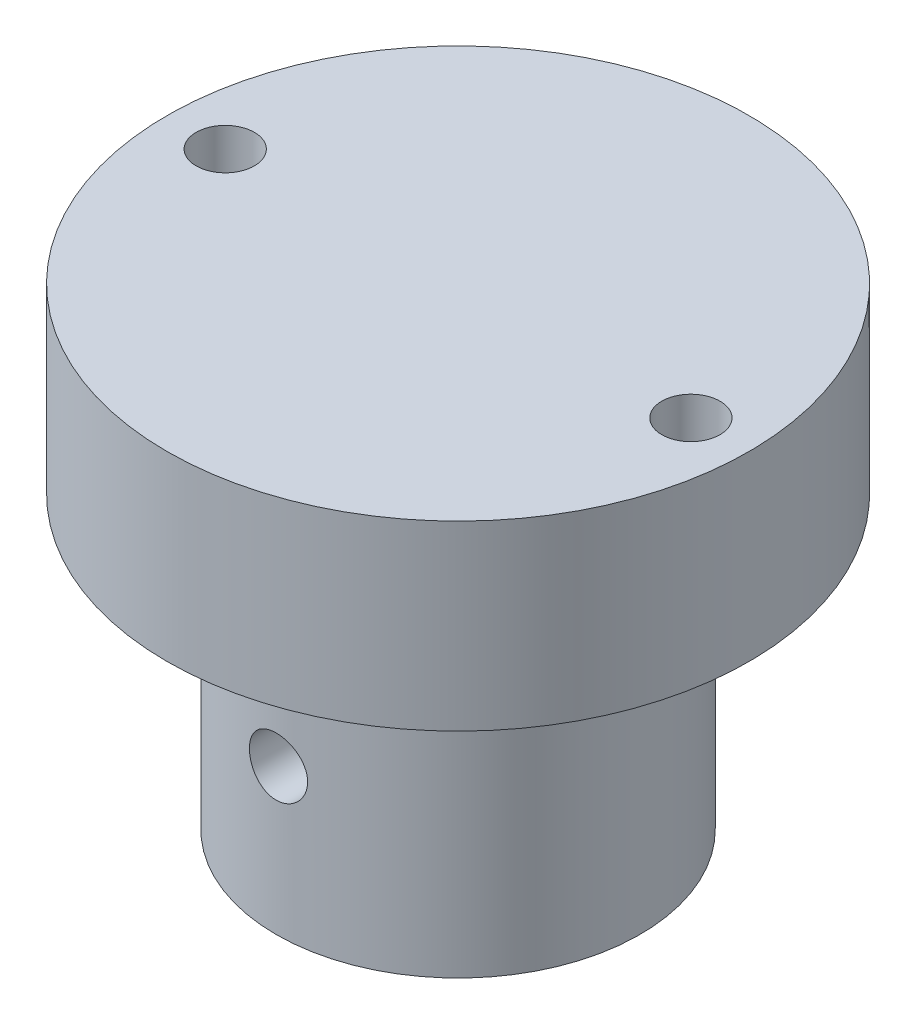
ISO-10303-21;
HEADER;
FILE_DESCRIPTION(('STEP AP214'),'2;1');
FILE_NAME('part.step','',(''),(''),'','','');
FILE_SCHEMA(('AUTOMOTIVE_DESIGN { 1 0 10303 214 1 1 1 1 }'));
ENDSEC;
DATA;
#1=APPLICATION_CONTEXT('core data for automotive mechanical design processes');
#2=APPLICATION_PROTOCOL_DEFINITION('international standard','automotive_design',2000,#1);
#3=PRODUCT_CONTEXT('',#1,'mechanical');
#4=PRODUCT('Part','Part','',(#3));
#5=PRODUCT_RELATED_PRODUCT_CATEGORY('part','',(#4));
#6=PRODUCT_DEFINITION_FORMATION('','',#4);
#7=PRODUCT_DEFINITION_CONTEXT('part definition',#1,'design');
#8=PRODUCT_DEFINITION('design','',#6,#7);
#9=PRODUCT_DEFINITION_SHAPE('','',#8);
#10=(LENGTH_UNIT() NAMED_UNIT(*) SI_UNIT(.MILLI.,.METRE.));
#11=(NAMED_UNIT(*) PLANE_ANGLE_UNIT() SI_UNIT($,.RADIAN.));
#12=(NAMED_UNIT(*) SI_UNIT($,.STERADIAN.) SOLID_ANGLE_UNIT());
#13=UNCERTAINTY_MEASURE_WITH_UNIT(LENGTH_MEASURE(1.E-05),#10,'distance_accuracy_value','');
#14=(GEOMETRIC_REPRESENTATION_CONTEXT(3) GLOBAL_UNCERTAINTY_ASSIGNED_CONTEXT((#13)) GLOBAL_UNIT_ASSIGNED_CONTEXT((#10,
#11,#12)) REPRESENTATION_CONTEXT('',''));
#15=CARTESIAN_POINT('',(0.,0.,0.));
#16=DIRECTION('',(0.,0.,1.));
#17=DIRECTION('',(1.,0.,0.));
#18=AXIS2_PLACEMENT_3D('',#15,#16,#17);
#19=CARTESIAN_POINT('',(0.,10.16,0.));
#20=DIRECTION('',(0.,-1.,0.));
#21=DIRECTION('',(0.,0.,-1.));
#22=AXIS2_PLACEMENT_3D('',#19,#20,#21);
#23=CYLINDRICAL_SURFACE('',#22,6.35);
#24=CARTESIAN_POINT('',(0.,0.,0.));
#25=DIRECTION('',(0.,1.,0.));
#26=DIRECTION('',(0.,0.,1.));
#27=AXIS2_PLACEMENT_3D('',#24,#25,#26);
#28=CIRCLE('',#27,6.35);
#29=CARTESIAN_POINT('',(0.,0.,6.35));
#30=VERTEX_POINT('',#29);
#31=EDGE_CURVE('E40',#30,#30,#28,.T.);
#32=ORIENTED_EDGE('',*,*,#31,.T.);
#33=EDGE_LOOP('',(#32));
#34=FACE_BOUND('',#33,.T.);
#35=CARTESIAN_POINT('',(-1.016,5.08,6.26819304106056));
#36=CARTESIAN_POINT('',(-1.01599769504324,5.13667589140187,6.26819403551404));
#37=CARTESIAN_POINT('',(-1.01124159204673,5.19338353794778,6.26897004691585));
#38=CARTESIAN_POINT('',(-0.992349783147829,5.30521003843499,6.27198771662539));
#39=CARTESIAN_POINT('',(-0.978205221741949,5.36032734104515,6.2742307586555));
#40=CARTESIAN_POINT('',(-0.94097334251936,5.46733847506112,6.27992208580791));
#41=CARTESIAN_POINT('',(-0.917893246383186,5.51923487039731,6.28336939742283));
#42=CARTESIAN_POINT('',(-0.86346305157436,5.61841217203581,6.29107968557929));
#43=CARTESIAN_POINT('',(-0.832113968966905,5.66569364442702,6.29534256188933));
#44=CARTESIAN_POINT('',(-0.761731472401225,5.75473521786042,6.30424698435201));
#45=CARTESIAN_POINT('',(-0.722637613434505,5.7964472668791,6.30889132920186));
#46=CARTESIAN_POINT('',(-0.6380058858614,5.87274896550724,6.31801047882019));
#47=CARTESIAN_POINT('',(-0.592467647153622,5.90733820577275,6.32248527383266));
#48=CARTESIAN_POINT('',(-0.495929877850886,5.96859154833621,6.33079062048891));
#49=CARTESIAN_POINT('',(-0.444901748992711,5.99521111869177,6.33461750200122));
#50=CARTESIAN_POINT('',(-0.339027005912608,6.03948344504246,6.34116475032308));
#51=CARTESIAN_POINT('',(-0.284180620955612,6.05713673888526,6.34388518350168));
#52=CARTESIAN_POINT('',(-0.172722097504602,6.08282895413612,6.34789326388865));
#53=CARTESIAN_POINT('',(-0.116128984586578,6.09094850865779,6.34919292097404));
#54=CARTESIAN_POINT('',(-0.00236972222130401,6.09759334610754,6.35025423457713));
#55=CARTESIAN_POINT('',(0.0547963909724093,6.09611923224563,6.35001598779185));
#56=CARTESIAN_POINT('',(0.167528095717094,6.08368176927201,6.34803788122686));
#57=CARTESIAN_POINT('',(0.223103535159279,6.07280518520236,6.34631175189527));
#58=CARTESIAN_POINT('',(0.331630194115818,6.04200797457068,6.34156712875674));
#59=CARTESIAN_POINT('',(0.384581338647916,6.02208708975682,6.33854859804658));
#60=CARTESIAN_POINT('',(0.486616241095792,5.97367946298034,6.33153486057529));
#61=CARTESIAN_POINT('',(0.535682593094869,5.94515665048293,6.32753555457914));
#62=CARTESIAN_POINT('',(0.628365353157727,5.88038121426257,6.31900517323919));
#63=CARTESIAN_POINT('',(0.6719813535878,5.84412801292924,6.31447405817029));
#64=CARTESIAN_POINT('',(0.753037465593561,5.7644387817114,6.30532473766966));
#65=CARTESIAN_POINT('',(0.790403046173726,5.72092694987282,6.30070612498814));
#66=CARTESIAN_POINT('',(0.8573144186034,5.62821187981386,6.29195154361697));
#67=CARTESIAN_POINT('',(0.886860148838747,5.57900859675378,6.28781557873035));
#68=CARTESIAN_POINT('',(0.937305880666645,5.47622450094184,6.28049450273244));
#69=CARTESIAN_POINT('',(0.958197450743346,5.42263947974057,6.27731031975346));
#70=CARTESIAN_POINT('',(0.990662758380679,5.31265860420519,6.27226911110825));
#71=CARTESIAN_POINT('',(1.00223724835111,5.25626297723492,6.27041197827617));
#72=CARTESIAN_POINT('',(1.01563601798795,5.14292706608188,6.26825571297972));
#73=CARTESIAN_POINT('',(1.0175662979846,5.08599962494034,6.26793964349315));
#74=CARTESIAN_POINT('',(1.01190383114509,4.97263472513705,6.26885623915126));
#75=CARTESIAN_POINT('',(1.00431142214299,4.91619724916445,6.27008884935381));
#76=CARTESIAN_POINT('',(0.979909280740693,4.80574761203425,6.27394830907495));
#77=CARTESIAN_POINT('',(0.963153030988743,4.75172332702417,6.2765670658449));
#78=CARTESIAN_POINT('',(0.920954759109688,4.64724984339553,6.2828970086701));
#79=CARTESIAN_POINT('',(0.895512254331345,4.59680084362561,6.28660825542792));
#80=CARTESIAN_POINT('',(0.836411663304454,4.50043682431462,6.29474459515927));
#81=CARTESIAN_POINT('',(0.802685364876786,4.45456413958641,6.29917550591062));
#82=CARTESIAN_POINT('',(0.728068669578291,4.36909156119654,6.30823469948976));
#83=CARTESIAN_POINT('',(0.687177809748396,4.32949207321086,6.31286299505751));
#84=CARTESIAN_POINT('',(0.598924255479659,4.25730553561683,6.32184877776935));
#85=CARTESIAN_POINT('',(0.551503536204841,4.22478899561172,6.3262032598522));
#86=CARTESIAN_POINT('',(0.451811058473387,4.16818417263784,6.3341032066333));
#87=CARTESIAN_POINT('',(0.399539447287974,4.14409563390402,6.33764869588096));
#88=CARTESIAN_POINT('',(0.291842838763925,4.10514153619851,6.34351807238694));
#89=CARTESIAN_POINT('',(0.236431715654078,4.09023840003212,6.34584693079896));
#90=CARTESIAN_POINT('',(0.123853069651673,4.06995689111261,6.34904160254437));
#91=CARTESIAN_POINT('',(0.0666856798149288,4.06457779861375,6.34990752643362));
#92=CARTESIAN_POINT('',(-0.0471008256588229,4.06351648657573,6.35007738794596));
#93=CARTESIAN_POINT('',(-0.103718941549757,4.06772673910333,6.34939864639168));
#94=CARTESIAN_POINT('',(-0.215430776217704,4.08549288984209,6.34659062021428));
#95=CARTESIAN_POINT('',(-0.270524501947229,4.09904874542205,6.34446134220797));
#96=CARTESIAN_POINT('',(-0.377587318541396,4.13508130301258,6.33899051703869));
#97=CARTESIAN_POINT('',(-0.42955931478101,4.15754955740056,6.33565011809443));
#98=CARTESIAN_POINT('',(-0.529012504739116,4.21075736987234,6.32812262419089));
#99=CARTESIAN_POINT('',(-0.576493512733801,4.24149726982623,6.3239354942377));
#100=CARTESIAN_POINT('',(-0.666160156866185,4.31076014675583,6.31512349568329));
#101=CARTESIAN_POINT('',(-0.708284350860755,4.34936214351927,6.31049445883438));
#102=CARTESIAN_POINT('',(-0.785495604939363,4.43308733338062,6.30135003139344));
#103=CARTESIAN_POINT('',(-0.820581013885812,4.47821205229844,6.29683466768324));
#104=CARTESIAN_POINT('',(-0.882925294022889,4.57404682035764,6.28839740566688));
#105=CARTESIAN_POINT('',(-0.910132119839209,4.62479108075766,6.28447953129439));
#106=CARTESIAN_POINT('',(-0.955594646553645,4.73017001117662,6.27772822250236));
#107=CARTESIAN_POINT('',(-0.973859433240997,4.78480066739026,6.27489368797267));
#108=CARTESIAN_POINT('',(-0.996878807164912,4.8797148827213,6.27126949983991));
#109=CARTESIAN_POINT('',(-1.00403797217713,4.91941880908197,6.27012211869688));
#110=CARTESIAN_POINT('',(-1.0135993503463,4.99940981043834,6.26858354172928));
#111=CARTESIAN_POINT('',(-1.01600163909125,5.03969687615756,6.26819233388894));
#112=CARTESIAN_POINT('',(-1.016,5.08,6.26819304106056));
#113=B_SPLINE_CURVE_WITH_KNOTS('',3,(#35,#36,#37,#38,#39,#40,#41,#42,#43,#44,#45,#46,#47,#48,
#49,#50,#51,#52,#53,#54,#55,#56,#57,#58,#59,#60,#61,#62,#63,#64,#65,#66,#67,#68,#69,#70,#71,#72,
#73,#74,#75,#76,#77,#78,#79,#80,#81,#82,#83,#84,#85,#86,#87,#88,#89,#90,#91,#92,#93,#94,#95,#96,
#97,#98,#99,#100,#101,#102,#103,#104,#105,#106,#107,#108,#109,#110,#111,#112),.UNSPECIFIED.,.T.,
.F.,(4,2,2,2,2,2,2,2,2,2,2,2,2,2,2,2,2,2,2,2,2,2,2,2,2,2,2,2,2,2,2,2,2,2,2,2,2,2,4),(0.,
0.169880321882361,0.339921108625201,0.509824754680403,0.679707533265704,0.850972488209638,
1.02224728291215,1.19446197226048,1.36666632998338,1.53740350435707,1.70812994359012,
1.87729755271594,2.04646999257357,2.21636192832832,2.38626656276549,2.5580715124197,
2.72987781571911,2.90185111382296,3.07381052266342,3.24387568815821,3.41393482046424,
3.58301187235558,3.75209832053258,3.92262673906721,4.09316618086042,4.26533272103383,
4.43749403600587,4.60894628660576,4.78038557975853,4.94991195458607,5.11943755610198,
5.28880285517363,5.45817515524958,5.62934216298827,5.80054927575461,5.97286283661862,
6.14500094858956,6.26580745520847,6.38661204216541),.UNSPECIFIED.);
#114=CARTESIAN_POINT('',(-1.016,5.08,6.26819304106056));
#115=VERTEX_POINT('',#114);
#116=EDGE_CURVE('E88',#115,#115,#113,.T.);
#117=ORIENTED_EDGE('',*,*,#116,.T.);
#118=EDGE_LOOP('',(#117));
#119=FACE_BOUND('',#118,.T.);
#120=CARTESIAN_POINT('',(1.016,5.08,-6.26819304106056));
#121=CARTESIAN_POINT('',(1.01599769504324,5.02332410859813,-6.26819403551404));
#122=CARTESIAN_POINT('',(1.01124159204673,4.96661646205222,-6.26897004691585));
#123=CARTESIAN_POINT('',(0.992349783147829,4.85478996156501,-6.27198771662539));
#124=CARTESIAN_POINT('',(0.978205221741949,4.79967265895485,-6.2742307586555));
#125=CARTESIAN_POINT('',(0.940973342519359,4.69266152493888,-6.27992208580791));
#126=CARTESIAN_POINT('',(0.917893246383186,4.64076512960269,-6.28336939742283));
#127=CARTESIAN_POINT('',(0.863463051574359,4.54158782796419,-6.29107968557929));
#128=CARTESIAN_POINT('',(0.832113968966905,4.49430635557297,-6.29534256188933));
#129=CARTESIAN_POINT('',(0.761731472401225,4.40526478213958,-6.30424698435201));
#130=CARTESIAN_POINT('',(0.722637613434505,4.3635527331209,-6.30889132920186));
#131=CARTESIAN_POINT('',(0.6380058858614,4.28725103449276,-6.31801047882019));
#132=CARTESIAN_POINT('',(0.592467647153622,4.25266179422725,-6.32248527383266));
#133=CARTESIAN_POINT('',(0.495929877850886,4.19140845166379,-6.33079062048891));
#134=CARTESIAN_POINT('',(0.444901748992711,4.16478888130823,-6.33461750200122));
#135=CARTESIAN_POINT('',(0.339027005912608,4.12051655495754,-6.34116475032308));
#136=CARTESIAN_POINT('',(0.284180620955612,4.10286326111474,-6.34388518350168));
#137=CARTESIAN_POINT('',(0.172722097504602,4.07717104586388,-6.34789326388865));
#138=CARTESIAN_POINT('',(0.116128984586579,4.06905149134221,-6.34919292097404));
#139=CARTESIAN_POINT('',(0.00236972222130401,4.06240665389246,-6.35025423457713));
#140=CARTESIAN_POINT('',(-0.0547963909724093,4.06388076775437,-6.35001598779185));
#141=CARTESIAN_POINT('',(-0.167528095717094,4.07631823072799,-6.34803788122686));
#142=CARTESIAN_POINT('',(-0.223103535159278,4.08719481479764,-6.34631175189527));
#143=CARTESIAN_POINT('',(-0.331630194115818,4.11799202542932,-6.34156712875674));
#144=CARTESIAN_POINT('',(-0.384581338647916,4.13791291024318,-6.33854859804658));
#145=CARTESIAN_POINT('',(-0.486616241095792,4.18632053701966,-6.33153486057529));
#146=CARTESIAN_POINT('',(-0.535682593094869,4.21484334951707,-6.32753555457914));
#147=CARTESIAN_POINT('',(-0.628365353157727,4.27961878573743,-6.31900517323919));
#148=CARTESIAN_POINT('',(-0.6719813535878,4.31587198707076,-6.31447405817029));
#149=CARTESIAN_POINT('',(-0.753037465593561,4.3955612182886,-6.30532473766966));
#150=CARTESIAN_POINT('',(-0.790403046173727,4.43907305012718,-6.30070612498814));
#151=CARTESIAN_POINT('',(-0.857314418603401,4.53178812018614,-6.29195154361697));
#152=CARTESIAN_POINT('',(-0.886860148838748,4.58099140324622,-6.28781557873035));
#153=CARTESIAN_POINT('',(-0.937305880666646,4.68377549905816,-6.28049450273244));
#154=CARTESIAN_POINT('',(-0.958197450743346,4.73736052025943,-6.27731031975346));
#155=CARTESIAN_POINT('',(-0.99066275838068,4.84734139579481,-6.27226911110825));
#156=CARTESIAN_POINT('',(-1.00223724835111,4.90373702276508,-6.27041197827617));
#157=CARTESIAN_POINT('',(-1.01563601798795,5.01707293391812,-6.26825571297972));
#158=CARTESIAN_POINT('',(-1.0175662979846,5.07400037505966,-6.26793964349315));
#159=CARTESIAN_POINT('',(-1.01190383114509,5.18736527486295,-6.26885623915126));
#160=CARTESIAN_POINT('',(-1.00431142214299,5.24380275083555,-6.27008884935381));
#161=CARTESIAN_POINT('',(-0.979909280740693,5.35425238796575,-6.27394830907495));
#162=CARTESIAN_POINT('',(-0.963153030988743,5.40827667297583,-6.2765670658449));
#163=CARTESIAN_POINT('',(-0.920954759109688,5.51275015660447,-6.2828970086701));
#164=CARTESIAN_POINT('',(-0.895512254331344,5.56319915637439,-6.28660825542792));
#165=CARTESIAN_POINT('',(-0.836411663304454,5.65956317568538,-6.29474459515927));
#166=CARTESIAN_POINT('',(-0.802685364876785,5.70543586041359,-6.29917550591062));
#167=CARTESIAN_POINT('',(-0.72806866957829,5.79090843880346,-6.30823469948976));
#168=CARTESIAN_POINT('',(-0.687177809748396,5.83050792678914,-6.31286299505751));
#169=CARTESIAN_POINT('',(-0.598924255479659,5.90269446438317,-6.32184877776935));
#170=CARTESIAN_POINT('',(-0.551503536204841,5.93521100438828,-6.3262032598522));
#171=CARTESIAN_POINT('',(-0.451811058473387,5.99181582736216,-6.3341032066333));
#172=CARTESIAN_POINT('',(-0.399539447287974,6.01590436609598,-6.33764869588096));
#173=CARTESIAN_POINT('',(-0.291842838763925,6.0548584638015,-6.34351807238694));
#174=CARTESIAN_POINT('',(-0.236431715654078,6.06976159996788,-6.34584693079896));
#175=CARTESIAN_POINT('',(-0.123853069651672,6.0900431088874,-6.34904160254437));
#176=CARTESIAN_POINT('',(-0.0666856798149287,6.09542220138625,-6.34990752643362));
#177=CARTESIAN_POINT('',(0.0471008256588229,6.09648351342427,-6.35007738794596));
#178=CARTESIAN_POINT('',(0.103718941549757,6.09227326089667,-6.34939864639168));
#179=CARTESIAN_POINT('',(0.215430776217704,6.07450711015791,-6.34659062021428));
#180=CARTESIAN_POINT('',(0.270524501947229,6.06095125457795,-6.34446134220797));
#181=CARTESIAN_POINT('',(0.377587318541396,6.02491869698742,-6.33899051703869));
#182=CARTESIAN_POINT('',(0.42955931478101,6.00245044259944,-6.33565011809443));
#183=CARTESIAN_POINT('',(0.529012504739117,5.94924263012766,-6.32812262419089));
#184=CARTESIAN_POINT('',(0.576493512733801,5.91850273017377,-6.3239354942377));
#185=CARTESIAN_POINT('',(0.666160156866185,5.84923985324417,-6.31512349568329));
#186=CARTESIAN_POINT('',(0.708284350860756,5.81063785648074,-6.31049445883438));
#187=CARTESIAN_POINT('',(0.785495604939363,5.72691266661938,-6.30135003139344));
#188=CARTESIAN_POINT('',(0.820581013885812,5.68178794770156,-6.29683466768324));
#189=CARTESIAN_POINT('',(0.882925294022889,5.58595317964236,-6.28839740566688));
#190=CARTESIAN_POINT('',(0.910132119839209,5.53520891924234,-6.28447953129439));
#191=CARTESIAN_POINT('',(0.955594646553645,5.42982998882338,-6.27772822250236));
#192=CARTESIAN_POINT('',(0.973859433240997,5.37519933260974,-6.27489368797267));
#193=CARTESIAN_POINT('',(0.996878807164912,5.2802851172787,-6.27126949983991));
#194=CARTESIAN_POINT('',(1.00403797217713,5.24058119091803,-6.27012211869688));
#195=CARTESIAN_POINT('',(1.0135993503463,5.16059018956166,-6.26858354172928));
#196=CARTESIAN_POINT('',(1.01600163909125,5.12030312384244,-6.26819233388894));
#197=CARTESIAN_POINT('',(1.016,5.08,-6.26819304106056));
#198=B_SPLINE_CURVE_WITH_KNOTS('',3,(#120,#121,#122,#123,#124,#125,#126,#127,#128,#129,#130,
#131,#132,#133,#134,#135,#136,#137,#138,#139,#140,#141,#142,#143,#144,#145,#146,#147,#148,#149,
#150,#151,#152,#153,#154,#155,#156,#157,#158,#159,#160,#161,#162,#163,#164,#165,#166,#167,#168,
#169,#170,#171,#172,#173,#174,#175,#176,#177,#178,#179,#180,#181,#182,#183,#184,#185,#186,#187,
#188,#189,#190,#191,#192,#193,#194,#195,#196,#197),.UNSPECIFIED.,.T.,.F.,(4,2,2,2,2,2,2,2,2,2,2,
2,2,2,2,2,2,2,2,2,2,2,2,2,2,2,2,2,2,2,2,2,2,2,2,2,2,2,4),(0.,0.169880321882361,
0.339921108625201,0.509824754680405,0.679707533265703,0.850972488209639,1.02224728291215,
1.19446197226048,1.36666632998338,1.53740350435707,1.70812994359012,1.87729755271594,
2.04646999257357,2.21636192832832,2.38626656276549,2.5580715124197,2.72987781571911,
2.90185111382296,3.07381052266342,3.24387568815821,3.41393482046425,3.58301187235559,
3.75209832053258,3.92262673906721,4.09316618086042,4.26533272103383,4.43749403600587,
4.60894628660576,4.78038557975853,4.94991195458607,5.11943755610198,5.28880285517363,
5.45817515524958,5.62934216298827,5.80054927575461,5.97286283661862,6.14500094858956,
6.26580745520847,6.38661204216541),.UNSPECIFIED.);
#199=CARTESIAN_POINT('',(1.016,5.08,-6.26819304106056));
#200=VERTEX_POINT('',#199);
#201=EDGE_CURVE('E61',#200,#200,#198,.T.);
#202=ORIENTED_EDGE('',*,*,#201,.F.);
#203=EDGE_LOOP('',(#202));
#204=FACE_BOUND('',#203,.T.);
#205=CARTESIAN_POINT('',(0.,10.16,0.));
#206=DIRECTION('',(0.,1.,0.));
#207=DIRECTION('',(0.,0.,1.));
#208=AXIS2_PLACEMENT_3D('',#205,#206,#207);
#209=CIRCLE('',#208,6.35);
#210=CARTESIAN_POINT('',(0.,10.16,6.35));
#211=VERTEX_POINT('',#210);
#212=EDGE_CURVE('E10',#211,#211,#209,.T.);
#213=ORIENTED_EDGE('',*,*,#212,.F.);
#214=EDGE_LOOP('',(#213));
#215=FACE_BOUND('',#214,.T.);
#216=ADVANCED_FACE('F34',(#34,#119,#204,#215),#23,.T.);
#217=CARTESIAN_POINT('',(0.,0.,0.));
#218=DIRECTION('',(0.,1.,0.));
#219=DIRECTION('',(0.,0.,1.));
#220=AXIS2_PLACEMENT_3D('',#217,#218,#219);
#221=PLANE('',#220);
#222=CARTESIAN_POINT('',(0.,0.,0.));
#223=DIRECTION('',(0.,1.,0.));
#224=DIRECTION('',(0.,0.,1.));
#225=AXIS2_PLACEMENT_3D('',#222,#223,#224);
#226=CIRCLE('',#225,4.7625);
#227=CARTESIAN_POINT('',(0.,0.,4.7625));
#228=VERTEX_POINT('',#227);
#229=EDGE_CURVE('E44',#228,#228,#226,.F.);
#230=ORIENTED_EDGE('',*,*,#229,.F.);
#231=EDGE_LOOP('',(#230));
#232=FACE_BOUND('',#231,.T.);
#233=ORIENTED_EDGE('',*,*,#31,.F.);
#234=EDGE_LOOP('',(#233));
#235=FACE_BOUND('',#234,.T.);
#236=ADVANCED_FACE('F103',(#232,#235),#221,.F.);
#237=CARTESIAN_POINT('',(0.,-13.4703841816037,0.));
#238=DIRECTION('',(0.,1.,0.));
#239=DIRECTION('',(0.,0.,1.));
#240=AXIS2_PLACEMENT_3D('',#237,#238,#239);
#241=CYLINDRICAL_SURFACE('',#240,4.7625);
#242=CARTESIAN_POINT('',(0.,4.064,4.7625));
#243=CARTESIAN_POINT('',(0.0563844626269982,4.06400197218595,4.76249895673298));
#244=CARTESIAN_POINT('',(0.112793074959932,4.06870956289452,4.76148846913532));
#245=CARTESIAN_POINT('',(0.224010350170093,4.08739736149324,4.75755499453595));
#246=CARTESIAN_POINT('',(0.278817800645456,4.10138441505622,4.75463059561945));
#247=CARTESIAN_POINT('',(0.385209148414719,4.1381749544907,4.74719518742165));
#248=CARTESIAN_POINT('',(0.436796268547741,4.16096945625211,4.74268579534767));
#249=CARTESIAN_POINT('',(0.53541152615669,4.21469985582769,4.73256813284778));
#250=CARTESIAN_POINT('',(0.582439826614029,4.24563546244394,4.72695990172791));
#251=CARTESIAN_POINT('',(0.671324662992692,4.31527129734554,4.71516380296902));
#252=CARTESIAN_POINT('',(0.713101409348593,4.35407221202044,4.70896903969119));
#253=CARTESIAN_POINT('',(0.789605682168651,4.43812100441461,4.69674711588073));
#254=CARTESIAN_POINT('',(0.824332604114973,4.4833694344384,4.69071996975937));
#255=CARTESIAN_POINT('',(0.886099813821638,4.57961402786303,4.67944791154241));
#256=CARTESIAN_POINT('',(0.913055847892545,4.63066539150595,4.67421184666522));
#257=CARTESIAN_POINT('',(0.957975859641681,4.73670332623058,4.66521347578965));
#258=CARTESIAN_POINT('',(0.975940856432099,4.79168945050883,4.66145100277374));
#259=CARTESIAN_POINT('',(1.00210651455278,4.90317257813505,4.65589591491856));
#260=CARTESIAN_POINT('',(1.01044807248282,4.95963506763405,4.65407490599859));
#261=CARTESIAN_POINT('',(1.01756803147105,5.07318520803569,4.65252359691289));
#262=CARTESIAN_POINT('',(1.01634754887166,5.13027278518395,4.65279305269101));
#263=CARTESIAN_POINT('',(1.00449161438515,5.24241011175321,4.65536649423502));
#264=CARTESIAN_POINT('',(0.994019193338168,5.29747802841131,4.65763524810735));
#265=CARTESIAN_POINT('',(0.964214663101186,5.40505691382844,4.66389601929689));
#266=CARTESIAN_POINT('',(0.944882078639877,5.45756774525473,4.6678881290566));
#267=CARTESIAN_POINT('',(0.897754543284647,5.55900359713452,4.67718090584143));
#268=CARTESIAN_POINT('',(0.869896333842204,5.60789829954254,4.68249129666887));
#269=CARTESIAN_POINT('',(0.806552865029542,5.70037957790027,4.69381624331275));
#270=CARTESIAN_POINT('',(0.771066614099411,5.74396546260813,4.69983089062834));
#271=CARTESIAN_POINT('',(0.692608449372287,5.82553111873822,4.71203825492389));
#272=CARTESIAN_POINT('',(0.649497749592723,5.86337734984353,4.71823209190476));
#273=CARTESIAN_POINT('',(0.557472061775644,5.93132380769153,4.72998725753749));
#274=CARTESIAN_POINT('',(0.508556978312316,5.96142390705971,4.7355485757876));
#275=CARTESIAN_POINT('',(0.406152401960311,6.01305418862972,4.74542878662929));
#276=CARTESIAN_POINT('',(0.352654170437358,6.03456753604906,4.74974523403599));
#277=CARTESIAN_POINT('',(0.242689727547827,6.06826278166471,4.75663108108472));
#278=CARTESIAN_POINT('',(0.186223927456014,6.08044596930084,4.75920072213205));
#279=CARTESIAN_POINT('',(0.0730732895603533,6.09494236316675,4.76226928636029));
#280=CARTESIAN_POINT('',(0.0164128428785989,6.0974380843006,4.76280649620917));
#281=CARTESIAN_POINT('',(-0.0965153559452791,6.09298246018006,4.76185667827924));
#282=CARTESIAN_POINT('',(-0.152783133125557,6.08603172290481,4.76036978077304));
#283=CARTESIAN_POINT('',(-0.26272874961146,6.06303192698763,4.75556291925799));
#284=CARTESIAN_POINT('',(-0.316427398217916,6.04707798168652,4.75226212732976));
#285=CARTESIAN_POINT('',(-0.420386761328544,6.0066297292361,4.74419668083851));
#286=CARTESIAN_POINT('',(-0.470647192553413,5.98213471938844,4.73943190583314));
#287=CARTESIAN_POINT('',(-0.567062588740857,5.92491507761741,4.72887226744177));
#288=CARTESIAN_POINT('',(-0.613151973933935,5.89208243316308,4.72306420231049));
#289=CARTESIAN_POINT('',(-0.699232510619353,5.81926245592079,4.71109034202162));
#290=CARTESIAN_POINT('',(-0.739222910204586,5.77927424228451,4.70492450288537));
#291=CARTESIAN_POINT('',(-0.8126868275149,5.69244261583642,4.69279871582542));
#292=CARTESIAN_POINT('',(-0.846034271432796,5.64549163418586,4.6868442476404));
#293=CARTESIAN_POINT('',(-0.90437086908975,5.5465480181901,4.67593882398893));
#294=CARTESIAN_POINT('',(-0.929360377887899,5.49455559813471,4.67098782589691));
#295=CARTESIAN_POINT('',(-0.970107325899269,5.38727994483906,4.66269566041667));
#296=CARTESIAN_POINT('',(-0.985915651792795,5.33201675798573,4.65934563831652));
#297=CARTESIAN_POINT('',(-1.00800226948227,5.21953824906641,4.65461787533928));
#298=CARTESIAN_POINT('',(-1.0142820003555,5.1623232231161,4.65323983664081));
#299=CARTESIAN_POINT('',(-1.01707426037763,5.04883467162915,4.65263018010158));
#300=CARTESIAN_POINT('',(-1.01378647180097,4.99256620194681,4.65335467962954));
#301=CARTESIAN_POINT('',(-0.997981735336247,4.8814046373794,4.65676957783197));
#302=CARTESIAN_POINT('',(-0.985464885429201,4.82651152789911,4.65945995563555));
#303=CARTESIAN_POINT('',(-0.951651657537014,4.71980815966414,4.6664825982999));
#304=CARTESIAN_POINT('',(-0.930382987590451,4.66798875675569,4.6708096779428));
#305=CARTESIAN_POINT('',(-0.879694180993217,4.56862365185605,4.68062046117072));
#306=CARTESIAN_POINT('',(-0.850273243242921,4.52107837047878,4.68610427841231));
#307=CARTESIAN_POINT('',(-0.783446902673266,4.43062380481957,4.69774268223457));
#308=CARTESIAN_POINT('',(-0.745898620808694,4.38782145785911,4.70390815442029));
#309=CARTESIAN_POINT('',(-0.664174661027307,4.30905949708915,4.71614058952408));
#310=CARTESIAN_POINT('',(-0.619997456785978,4.27310146353533,4.72220752939737));
#311=CARTESIAN_POINT('',(-0.525620103169967,4.20863011494492,4.73364704227093));
#312=CARTESIAN_POINT('',(-0.475353001223227,4.18021305821916,4.73901023281778));
#313=CARTESIAN_POINT('',(-0.370653335418522,4.13227583591658,4.74834441943046));
#314=CARTESIAN_POINT('',(-0.316224390091353,4.11274804199504,4.75231660850988));
#315=CARTESIAN_POINT('',(-0.218100124570983,4.08671410054972,4.75769368190114));
#316=CARTESIAN_POINT('',(-0.174944300637535,4.07821224319641,4.75948507228609));
#317=CARTESIAN_POINT('',(-0.0878638522627294,4.06685453836095,4.7618886140483));
#318=CARTESIAN_POINT('',(-0.043939258907308,4.06399846311581,4.76250081299666));
#319=CARTESIAN_POINT('',(0.,4.064,4.7625));
#320=B_SPLINE_CURVE_WITH_KNOTS('',3,(#242,#243,#244,#245,#246,#247,#248,#249,#250,#251,#252,
#253,#254,#255,#256,#257,#258,#259,#260,#261,#262,#263,#264,#265,#266,#267,#268,#269,#270,#271,
#272,#273,#274,#275,#276,#277,#278,#279,#280,#281,#282,#283,#284,#285,#286,#287,#288,#289,#290,
#291,#292,#293,#294,#295,#296,#297,#298,#299,#300,#301,#302,#303,#304,#305,#306,#307,#308,#309,
#310,#311,#312,#313,#314,#315,#316,#317,#318,#319),.UNSPECIFIED.,.T.,.F.,(4,2,2,2,2,2,2,2,2,2,2,
2,2,2,2,2,2,2,2,2,2,2,2,2,2,2,2,2,2,2,2,2,2,2,2,2,2,2,4),(0.,0.168992580387775,
0.338109969319217,0.507055302161209,0.675994592844598,0.847251218816111,1.0185225237342,
1.19158638441572,1.36463062428471,1.53510782090322,1.70556511506571,1.87307734451114,
2.04059856059405,2.20939419332268,2.37821178087482,2.55049693260358,2.72278491714456,
2.89540904151401,3.06800930470524,3.2373414755477,3.40666274859645,3.57422786165849,
3.7418067640464,3.91167848623336,4.08157113397952,4.25443220932223,4.42728594030375,
4.59917225493719,4.77103260747243,4.93933197990242,5.10762956559519,5.27539837560668,
5.44318367762093,5.61420081535429,5.78525739076936,5.95840251613624,6.1313987751364,
6.26309655094659,6.39478901367686),.UNSPECIFIED.);
#321=CARTESIAN_POINT('',(0.,4.064,4.7625));
#322=VERTEX_POINT('',#321);
#323=EDGE_CURVE('E60',#322,#322,#320,.T.);
#324=ORIENTED_EDGE('',*,*,#323,.T.);
#325=EDGE_LOOP('',(#324));
#326=FACE_BOUND('',#325,.T.);
#327=CARTESIAN_POINT('',(1.016,5.08,-4.65286473583748));
#328=CARTESIAN_POINT('',(1.01599801576459,5.02363199611472,-4.65286587355159));
#329=CARTESIAN_POINT('',(1.01129307972245,4.96723981197879,-4.65390020873217));
#330=CARTESIAN_POINT('',(0.992616780304669,4.8560566408187,-4.65791864150835));
#331=CARTESIAN_POINT('',(0.978638505946928,4.80126687982467,-4.66090419322901));
#332=CARTESIAN_POINT('',(0.941873629948345,4.69491300875087,-4.66847189208986));
#333=CARTESIAN_POINT('',(0.919096424076568,4.64334552583238,-4.67305233564265));
#334=CARTESIAN_POINT('',(0.865406803845663,4.5447634157256,-4.68329167418235));
#335=CARTESIAN_POINT('',(0.834494641415611,4.49774864760731,-4.68895053577054));
#336=CARTESIAN_POINT('',(0.764882917069572,4.40884955213112,-4.70081072765601));
#337=CARTESIAN_POINT('',(0.726077399805327,4.36704906536019,-4.70701870855264));
#338=CARTESIAN_POINT('',(0.642009303727055,4.29049868193295,-4.71921934129388));
#339=CARTESIAN_POINT('',(0.596746238450537,4.25574931693261,-4.72521197687341));
#340=CARTESIAN_POINT('',(0.500487812751034,4.19395780008074,-4.73637893556834));
#341=CARTESIAN_POINT('',(0.449439766159015,4.16699600305621,-4.74154449775951));
#342=CARTESIAN_POINT('',(0.343408992865178,4.12206443471455,-4.75040028963118));
#343=CARTESIAN_POINT('',(0.2884266865581,4.1040937042935,-4.75409067666458));
#344=CARTESIAN_POINT('',(0.176959423376637,4.0779172888985,-4.75953331786731));
#345=CARTESIAN_POINT('',(0.120509163264131,4.06956979888488,-4.76131368945404));
#346=CARTESIAN_POINT('',(0.00698327740264822,4.06243373225018,-4.76283302707285));
#347=CARTESIAN_POINT('',(-0.0500922794704652,4.06364411320238,-4.76257221572606));
#348=CARTESIAN_POINT('',(-0.162271965507563,4.07548324073808,-4.7600601512617));
#349=CARTESIAN_POINT('',(-0.217393051880008,4.08595917012595,-4.75784119526682));
#350=CARTESIAN_POINT('',(-0.32507642769087,4.11578883797506,-4.75169884956543));
#351=CARTESIAN_POINT('',(-0.377638605097908,4.13514296474598,-4.74777538530848));
#352=CARTESIAN_POINT('',(-0.479139810629404,4.18231669521762,-4.7386125422121));
#353=CARTESIAN_POINT('',(-0.528050799680562,4.21019479961588,-4.7333641148739));
#354=CARTESIAN_POINT('',(-0.620556385989134,4.27358160752587,-4.72212775676388));
#355=CARTESIAN_POINT('',(-0.664150290930594,4.30909130305708,-4.71613972989567));
#356=CARTESIAN_POINT('',(-0.745692556840183,4.3875671921219,-4.70394354557891));
#357=CARTESIAN_POINT('',(-0.783512004187261,4.43066713698549,-4.69773337718632));
#358=CARTESIAN_POINT('',(-0.851409398130919,4.52266140472845,-4.68590435079412));
#359=CARTESIAN_POINT('',(-0.881487155009426,4.57155586956562,-4.68028550728753));
#360=CARTESIAN_POINT('',(-0.933100814054981,4.67395272913545,-4.67027038667192));
#361=CARTESIAN_POINT('',(-0.954613394604409,4.72746722847117,-4.66587745711669));
#362=CARTESIAN_POINT('',(-0.988302228565441,4.83746732841685,-4.65885867259004));
#363=CARTESIAN_POINT('',(-1.00047988358828,4.89395248163048,-4.65623255234473));
#364=CARTESIAN_POINT('',(-1.01495540045912,5.00711537309925,-4.65309855219237));
#365=CARTESIAN_POINT('',(-1.01744051117202,5.06376807485455,-4.65255053162509));
#366=CARTESIAN_POINT('',(-1.01296643735987,5.17667832595532,-4.65352665668286));
#367=CARTESIAN_POINT('',(-1.00600786765198,5.23293590078527,-4.65505066741133));
#368=CARTESIAN_POINT('',(-0.983006122743021,5.34281369356198,-4.65996132495301));
#369=CARTESIAN_POINT('',(-0.967065162986004,5.3964563324819,-4.66332700220772));
#370=CARTESIAN_POINT('',(-0.92666140620764,5.50030935704661,-4.6715230064747));
#371=CARTESIAN_POINT('',(-0.902197826525816,5.55051942696044,-4.6763534679977));
#372=CARTESIAN_POINT('',(-0.845027372661013,5.64689503910788,-4.68702355052558));
#373=CARTESIAN_POINT('',(-0.812204610327412,5.69299027831668,-4.69287696213641));
#374=CARTESIAN_POINT('',(-0.739399983920291,5.77908715204884,-4.70489661374079));
#375=CARTESIAN_POINT('',(-0.699417276194534,5.81908806745245,-4.71106289053763));
#376=CARTESIAN_POINT('',(-0.612582372440938,5.89258260974685,-4.72314520438194));
#377=CARTESIAN_POINT('',(-0.565621360424497,5.92594888548682,-4.72905490161764));
#378=CARTESIAN_POINT('',(-0.466651893822959,5.9843185022617,-4.7398434994514));
#379=CARTESIAN_POINT('',(-0.414643668672484,6.00932222320945,-4.74472244687296));
#380=CARTESIAN_POINT('',(-0.307371690627028,6.05007714389902,-4.75287298394571));
#381=CARTESIAN_POINT('',(-0.252130347809044,6.06588526718682,-4.75615444145243));
#382=CARTESIAN_POINT('',(-0.139698545848657,6.08797885014264,-4.76078283475008));
#383=CARTESIAN_POINT('',(-0.0825083566509153,6.09426562322336,-4.76213003735845));
#384=CARTESIAN_POINT('',(0.0309865827629288,6.09708141023559,-4.76273068322822));
#385=CARTESIAN_POINT('',(0.0872864749104618,6.0938009486539,-4.76202500874447));
#386=CARTESIAN_POINT('',(0.198512857553866,6.07799992160309,-4.75868629565214));
#387=CARTESIAN_POINT('',(0.253439370421762,6.06547950675213,-4.75605328846052));
#388=CARTESIAN_POINT('',(0.360220928577693,6.03164337544492,-4.74915823186809));
#389=CARTESIAN_POINT('',(0.412084479675825,6.01035346559589,-4.74490096497895));
#390=CARTESIAN_POINT('',(0.511529232397217,5.95960833262389,-4.73521310143927));
#391=CARTESIAN_POINT('',(0.559110039980568,5.93015235918579,-4.72978239698093));
#392=CARTESIAN_POINT('',(0.64957185032592,5.86328362381826,-4.71821812480735));
#393=CARTESIAN_POINT('',(0.692351902892584,5.8257361769139,-4.71207359112307));
#394=CARTESIAN_POINT('',(0.771069274587618,5.74402353930552,-4.69983500698915));
#395=CARTESIAN_POINT('',(0.807004951719804,5.6998567651251,-4.69374096898822));
#396=CARTESIAN_POINT('',(0.871447372813972,5.60549135346752,-4.68220821171785));
#397=CARTESIAN_POINT('',(0.899854967305772,5.55522382102202,-4.67677870140351));
#398=CARTESIAN_POINT('',(0.947774386136034,5.45052423861257,-4.6673044952787));
#399=CARTESIAN_POINT('',(0.967293901331952,5.39609583686824,-4.6632586029809));
#400=CARTESIAN_POINT('',(0.993308451476766,5.29799255895959,-4.65777558865696));
#401=CARTESIAN_POINT('',(1.0018017938676,5.25485837708191,-4.65594599724294));
#402=CARTESIAN_POINT('',(1.01314821661666,5.16782100023122,-4.65349015418274));
#403=CARTESIAN_POINT('',(1.01600154597157,5.12391783929362,-4.65286384941359));
#404=CARTESIAN_POINT('',(1.016,5.08,-4.65286473583748));
#405=B_SPLINE_CURVE_WITH_KNOTS('',3,(#327,#328,#329,#330,#331,#332,#333,#334,#335,#336,#337,
#338,#339,#340,#341,#342,#343,#344,#345,#346,#347,#348,#349,#350,#351,#352,#353,#354,#355,#356,
#357,#358,#359,#360,#361,#362,#363,#364,#365,#366,#367,#368,#369,#370,#371,#372,#373,#374,#375,
#376,#377,#378,#379,#380,#381,#382,#383,#384,#385,#386,#387,#388,#389,#390,#391,#392,#393,#394,
#395,#396,#397,#398,#399,#400,#401,#402,#403,#404),.UNSPECIFIED.,.T.,.F.,(4,2,2,2,2,2,2,2,2,2,2,
2,2,2,2,2,2,2,2,2,2,2,2,2,2,2,2,2,2,2,2,2,2,2,2,2,2,2,4),(0.,0.168943102373727,
0.338012251731802,0.506901360695407,0.675785239997249,0.847106600001079,1.01844087287296,
1.19148456800221,1.36450980010617,1.53495141535315,1.70537444168626,1.8730380201716,
2.04070893253287,2.2095574437046,2.37842791653915,2.55064297068741,2.72286224474066,
2.89554728924748,3.0682064005284,3.23751291387655,3.40680840529761,3.57421520787043,
3.74163738801987,3.91152063096912,4.08142390434977,4.25432674977969,4.42722173912492,
4.59903474238004,4.77082404291084,4.93921579006353,5.10760479236505,5.27550176512364,
5.44341416972544,5.61437351952117,5.78537383170836,5.95852545997569,6.13152697403303,
6.26316093467031,6.39478908376915),.UNSPECIFIED.);
#406=CARTESIAN_POINT('',(1.016,5.08,-4.65286473583748));
#407=VERTEX_POINT('',#406);
#408=EDGE_CURVE('E53',#407,#407,#405,.T.);
#409=ORIENTED_EDGE('',*,*,#408,.T.);
#410=EDGE_LOOP('',(#409));
#411=FACE_BOUND('',#410,.T.);
#412=ORIENTED_EDGE('',*,*,#229,.T.);
#413=EDGE_LOOP('',(#412));
#414=FACE_BOUND('',#413,.T.);
#415=CARTESIAN_POINT('',(0.,10.16,0.));
#416=DIRECTION('',(0.,1.,0.));
#417=DIRECTION('',(0.,0.,1.));
#418=AXIS2_PLACEMENT_3D('',#415,#416,#417);
#419=CIRCLE('',#418,4.7625);
#420=CARTESIAN_POINT('',(0.,10.16,4.7625));
#421=VERTEX_POINT('',#420);
#422=EDGE_CURVE('E49',#421,#421,#419,.T.);
#423=ORIENTED_EDGE('',*,*,#422,.T.);
#424=EDGE_LOOP('',(#423));
#425=FACE_BOUND('',#424,.T.);
#426=ADVANCED_FACE('F65',(#326,#411,#414,#425),#241,.F.);
#427=CARTESIAN_POINT('',(0.,10.16,0.));
#428=DIRECTION('',(0.,1.,0.));
#429=DIRECTION('',(0.,0.,1.));
#430=AXIS2_PLACEMENT_3D('',#427,#428,#429);
#431=PLANE('',#430);
#432=ORIENTED_EDGE('',*,*,#422,.F.);
#433=EDGE_LOOP('',(#432));
#434=FACE_BOUND('',#433,.T.);
#435=ADVANCED_FACE('F102',(#434),#431,.F.);
#436=CARTESIAN_POINT('',(0.,5.08,-6.351));
#437=DIRECTION('',(0.,0.,1.));
#438=DIRECTION('',(1.,0.,0.));
#439=AXIS2_PLACEMENT_3D('',#436,#437,#438);
#440=CYLINDRICAL_SURFACE('',#439,1.016);
#441=ORIENTED_EDGE('',*,*,#201,.T.);
#442=EDGE_LOOP('',(#441));
#443=FACE_BOUND('',#442,.T.);
#444=ORIENTED_EDGE('',*,*,#408,.F.);
#445=EDGE_LOOP('',(#444));
#446=FACE_BOUND('',#445,.T.);
#447=ADVANCED_FACE('F74',(#443,#446),#440,.F.);
#448=ORIENTED_EDGE('',*,*,#116,.F.);
#449=EDGE_LOOP('',(#448));
#450=FACE_BOUND('',#449,.T.);
#451=ORIENTED_EDGE('',*,*,#323,.F.);
#452=EDGE_LOOP('',(#451));
#453=FACE_BOUND('',#452,.T.);
#454=ADVANCED_FACE('F68',(#450,#453),#440,.F.);
#455=CARTESIAN_POINT('',(0.,10.16,0.));
#456=DIRECTION('',(0.,1.,0.));
#457=DIRECTION('',(0.,0.,1.));
#458=AXIS2_PLACEMENT_3D('',#455,#456,#457);
#459=CYLINDRICAL_SURFACE('',#458,10.16);
#460=CARTESIAN_POINT('',(0.,10.16,0.));
#461=DIRECTION('',(0.,1.,0.));
#462=DIRECTION('',(0.,0.,1.));
#463=AXIS2_PLACEMENT_3D('',#460,#461,#462);
#464=CIRCLE('',#463,10.16);
#465=CARTESIAN_POINT('',(0.,10.16,10.16));
#466=VERTEX_POINT('',#465);
#467=EDGE_CURVE('E156',#466,#466,#464,.T.);
#468=ORIENTED_EDGE('',*,*,#467,.T.);
#469=EDGE_LOOP('',(#468));
#470=FACE_BOUND('',#469,.T.);
#471=CARTESIAN_POINT('',(0.,16.51,0.));
#472=DIRECTION('',(0.,1.,0.));
#473=DIRECTION('',(0.,0.,1.));
#474=AXIS2_PLACEMENT_3D('',#471,#472,#473);
#475=CIRCLE('',#474,10.16);
#476=CARTESIAN_POINT('',(0.,16.51,10.16));
#477=VERTEX_POINT('',#476);
#478=EDGE_CURVE('E154',#477,#477,#475,.T.);
#479=ORIENTED_EDGE('',*,*,#478,.F.);
#480=EDGE_LOOP('',(#479));
#481=FACE_BOUND('',#480,.T.);
#482=ADVANCED_FACE('F73',(#470,#481),#459,.T.);
#483=CARTESIAN_POINT('',(0.,10.16,0.));
#484=DIRECTION('',(0.,1.,0.));
#485=DIRECTION('',(0.,0.,1.));
#486=AXIS2_PLACEMENT_3D('',#483,#484,#485);
#487=PLANE('',#486);
#488=CARTESIAN_POINT('',(8.128,10.16,0.));
#489=DIRECTION('',(0.,1.,0.));
#490=DIRECTION('',(0.,0.,1.));
#491=AXIS2_PLACEMENT_3D('',#488,#489,#490);
#492=CIRCLE('',#491,1.016);
#493=CARTESIAN_POINT('',(8.128,10.16,1.016));
#494=VERTEX_POINT('',#493);
#495=EDGE_CURVE('E157',#494,#494,#492,.F.);
#496=ORIENTED_EDGE('',*,*,#495,.F.);
#497=EDGE_LOOP('',(#496));
#498=FACE_BOUND('',#497,.T.);
#499=CARTESIAN_POINT('',(-8.128,10.16,0.));
#500=DIRECTION('',(0.,1.,0.));
#501=DIRECTION('',(0.,0.,1.));
#502=AXIS2_PLACEMENT_3D('',#499,#500,#501);
#503=CIRCLE('',#502,1.016);
#504=CARTESIAN_POINT('',(-8.128,10.16,1.016));
#505=VERTEX_POINT('',#504);
#506=EDGE_CURVE('E163',#505,#505,#503,.F.);
#507=ORIENTED_EDGE('',*,*,#506,.F.);
#508=EDGE_LOOP('',(#507));
#509=FACE_BOUND('',#508,.T.);
#510=ORIENTED_EDGE('',*,*,#212,.T.);
#511=EDGE_LOOP('',(#510));
#512=FACE_BOUND('',#511,.T.);
#513=ORIENTED_EDGE('',*,*,#467,.F.);
#514=EDGE_LOOP('',(#513));
#515=FACE_BOUND('',#514,.T.);
#516=ADVANCED_FACE('F133',(#498,#509,#512,#515),#487,.F.);
#517=CARTESIAN_POINT('',(0.,16.51,0.));
#518=DIRECTION('',(0.,1.,0.));
#519=DIRECTION('',(0.,0.,1.));
#520=AXIS2_PLACEMENT_3D('',#517,#518,#519);
#521=PLANE('',#520);
#522=CARTESIAN_POINT('',(8.128,16.51,0.));
#523=DIRECTION('',(0.,1.,0.));
#524=DIRECTION('',(0.,0.,1.));
#525=AXIS2_PLACEMENT_3D('',#522,#523,#524);
#526=CIRCLE('',#525,1.016);
#527=CARTESIAN_POINT('',(8.128,16.51,1.016));
#528=VERTEX_POINT('',#527);
#529=EDGE_CURVE('E147',#528,#528,#526,.T.);
#530=ORIENTED_EDGE('',*,*,#529,.F.);
#531=EDGE_LOOP('',(#530));
#532=FACE_BOUND('',#531,.T.);
#533=CARTESIAN_POINT('',(-8.128,16.51,0.));
#534=DIRECTION('',(0.,1.,0.));
#535=DIRECTION('',(0.,0.,1.));
#536=AXIS2_PLACEMENT_3D('',#533,#534,#535);
#537=CIRCLE('',#536,1.016);
#538=CARTESIAN_POINT('',(-8.128,16.51,1.016));
#539=VERTEX_POINT('',#538);
#540=EDGE_CURVE('E151',#539,#539,#537,.T.);
#541=ORIENTED_EDGE('',*,*,#540,.F.);
#542=EDGE_LOOP('',(#541));
#543=FACE_BOUND('',#542,.T.);
#544=ORIENTED_EDGE('',*,*,#478,.T.);
#545=EDGE_LOOP('',(#544));
#546=FACE_BOUND('',#545,.T.);
#547=ADVANCED_FACE('F130',(#532,#543,#546),#521,.T.);
#548=CARTESIAN_POINT('',(-8.128,7.28631804125787,0.));
#549=DIRECTION('',(0.,1.,0.));
#550=DIRECTION('',(0.,0.,1.));
#551=AXIS2_PLACEMENT_3D('',#548,#549,#550);
#552=CYLINDRICAL_SURFACE('',#551,1.016);
#553=ORIENTED_EDGE('',*,*,#506,.T.);
#554=EDGE_LOOP('',(#553));
#555=FACE_BOUND('',#554,.T.);
#556=ORIENTED_EDGE('',*,*,#540,.T.);
#557=EDGE_LOOP('',(#556));
#558=FACE_BOUND('',#557,.T.);
#559=ADVANCED_FACE('F132',(#555,#558),#552,.F.);
#560=CARTESIAN_POINT('',(8.128,7.28631804125787,0.));
#561=DIRECTION('',(0.,1.,0.));
#562=DIRECTION('',(0.,0.,1.));
#563=AXIS2_PLACEMENT_3D('',#560,#561,#562);
#564=CYLINDRICAL_SURFACE('',#563,1.016);
#565=ORIENTED_EDGE('',*,*,#495,.T.);
#566=EDGE_LOOP('',(#565));
#567=FACE_BOUND('',#566,.T.);
#568=ORIENTED_EDGE('',*,*,#529,.T.);
#569=EDGE_LOOP('',(#568));
#570=FACE_BOUND('',#569,.T.);
#571=ADVANCED_FACE('F139',(#567,#570),#564,.F.);
#572=CLOSED_SHELL('',(#216,#236,#426,#435,#447,#454,#482,#516,#547,#559,#571));
#573=MANIFOLD_SOLID_BREP('B2',#572);
#574=ADVANCED_BREP_SHAPE_REPRESENTATION('',(#18,#573),#14);
#575=SHAPE_DEFINITION_REPRESENTATION(#9,#574);
ENDSEC;
END-ISO-10303-21;
